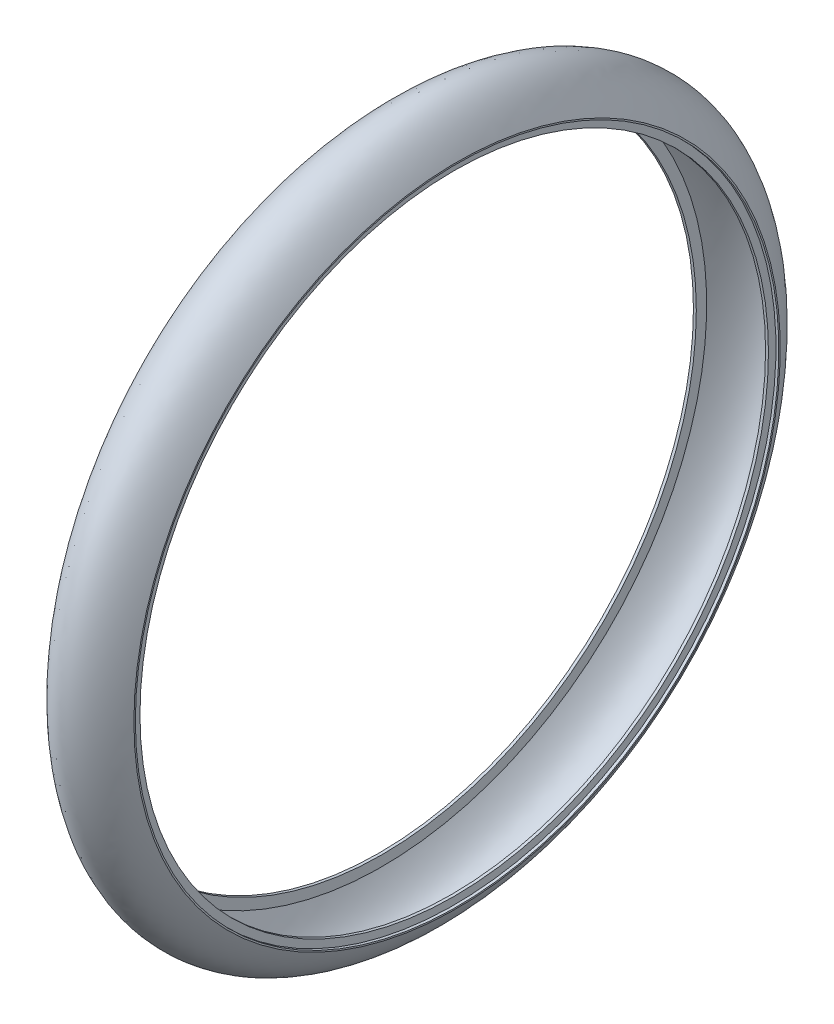
ISO-10303-21;
HEADER;
FILE_DESCRIPTION(('STEP AP214'),'2;1');
FILE_NAME('part.step','',(''),(''),'','','');
FILE_SCHEMA(('AUTOMOTIVE_DESIGN { 1 0 10303 214 1 1 1 1 }'));
ENDSEC;
DATA;
#1=APPLICATION_CONTEXT('core data for automotive mechanical design processes');
#2=APPLICATION_PROTOCOL_DEFINITION('international standard','automotive_design',2000,#1);
#3=PRODUCT_CONTEXT('',#1,'mechanical');
#4=PRODUCT('Part','Part','',(#3));
#5=PRODUCT_RELATED_PRODUCT_CATEGORY('part','',(#4));
#6=PRODUCT_DEFINITION_FORMATION('','',#4);
#7=PRODUCT_DEFINITION_CONTEXT('part definition',#1,'design');
#8=PRODUCT_DEFINITION('design','',#6,#7);
#9=PRODUCT_DEFINITION_SHAPE('','',#8);
#10=(LENGTH_UNIT() NAMED_UNIT(*) SI_UNIT(.MILLI.,.METRE.));
#11=(NAMED_UNIT(*) PLANE_ANGLE_UNIT() SI_UNIT($,.RADIAN.));
#12=(NAMED_UNIT(*) SI_UNIT($,.STERADIAN.) SOLID_ANGLE_UNIT());
#13=UNCERTAINTY_MEASURE_WITH_UNIT(LENGTH_MEASURE(1.E-05),#10,'distance_accuracy_value','');
#14=(GEOMETRIC_REPRESENTATION_CONTEXT(3) GLOBAL_UNCERTAINTY_ASSIGNED_CONTEXT((#13)) GLOBAL_UNIT_ASSIGNED_CONTEXT((#10,
#11,#12)) REPRESENTATION_CONTEXT('',''));
#15=CARTESIAN_POINT('',(0.,0.,0.));
#16=DIRECTION('',(0.,0.,1.));
#17=DIRECTION('',(1.,0.,0.));
#18=AXIS2_PLACEMENT_3D('',#15,#16,#17);
#19=CARTESIAN_POINT('',(-92.7298837551883,0.,0.));
#20=DIRECTION('',(-1.,0.,0.));
#21=DIRECTION('',(0.,0.,1.));
#22=AXIS2_PLACEMENT_3D('',#19,#20,#21);
#23=CYLINDRICAL_SURFACE('',#22,223.);
#24=CARTESIAN_POINT('',(28.,0.,0.));
#25=DIRECTION('',(-1.,0.,0.));
#26=DIRECTION('',(0.,0.,1.));
#27=AXIS2_PLACEMENT_3D('',#24,#25,#26);
#28=CIRCLE('',#27,223.);
#29=CARTESIAN_POINT('',(28.,0.,223.));
#30=VERTEX_POINT('',#29);
#31=EDGE_CURVE('E10',#30,#30,#28,.T.);
#32=ORIENTED_EDGE('',*,*,#31,.F.);
#33=EDGE_LOOP('',(#32));
#34=FACE_BOUND('',#33,.T.);
#35=CARTESIAN_POINT('',(26.,0.,0.));
#36=DIRECTION('',(-1.,0.,0.));
#37=DIRECTION('',(0.,0.,1.));
#38=AXIS2_PLACEMENT_3D('',#35,#36,#37);
#39=CIRCLE('',#38,223.);
#40=CARTESIAN_POINT('',(26.,0.,223.));
#41=VERTEX_POINT('',#40);
#42=EDGE_CURVE('E77',#41,#41,#39,.T.);
#43=ORIENTED_EDGE('',*,*,#42,.T.);
#44=EDGE_LOOP('',(#43));
#45=FACE_BOUND('',#44,.T.);
#46=ADVANCED_FACE('F31',(#34,#45),#23,.F.);
#47=CARTESIAN_POINT('',(28.,223.,0.));
#48=DIRECTION('',(-1.,0.,0.));
#49=DIRECTION('',(0.,0.,1.));
#50=AXIS2_PLACEMENT_3D('',#47,#48,#49);
#51=PLANE('',#50);
#52=CARTESIAN_POINT('',(28.,0.,0.));
#53=DIRECTION('',(-1.,0.,0.));
#54=DIRECTION('',(0.,0.,1.));
#55=AXIS2_PLACEMENT_3D('',#52,#53,#54);
#56=CIRCLE('',#55,224.);
#57=CARTESIAN_POINT('',(28.,0.,224.));
#58=VERTEX_POINT('',#57);
#59=EDGE_CURVE('E37',#58,#58,#56,.T.);
#60=ORIENTED_EDGE('',*,*,#59,.F.);
#61=EDGE_LOOP('',(#60));
#62=FACE_BOUND('',#61,.T.);
#63=ORIENTED_EDGE('',*,*,#31,.T.);
#64=EDGE_LOOP('',(#63));
#65=FACE_BOUND('',#64,.T.);
#66=ADVANCED_FACE('F124',(#62,#65),#51,.F.);
#67=CARTESIAN_POINT('',(28.,224.,0.));
#68=CARTESIAN_POINT('',(0.637105463980107,273.282336613174,0.));
#69=CARTESIAN_POINT('',(-28.,224.,0.));
#70=B_SPLINE_CURVE_WITH_KNOTS('',2,(#67,#68,#69),.UNSPECIFIED.,.F.,.F.,(3,3),(0.,1.),.UNSPECIFIED.);
#71=CARTESIAN_POINT('',(-92.7298837551883,0.,0.));
#72=DIRECTION('',(-1.,0.,0.));
#73=AXIS1_PLACEMENT('',#71,#72);
#74=SURFACE_OF_REVOLUTION('',#70,#73);
#75=CARTESIAN_POINT('',(-28.,0.,0.));
#76=DIRECTION('',(-1.,0.,0.));
#77=DIRECTION('',(0.,0.,1.));
#78=AXIS2_PLACEMENT_3D('',#75,#76,#77);
#79=CIRCLE('',#78,224.);
#80=CARTESIAN_POINT('',(-28.,0.,224.));
#81=VERTEX_POINT('',#80);
#82=EDGE_CURVE('E41',#81,#81,#79,.T.);
#83=ORIENTED_EDGE('',*,*,#82,.F.);
#84=EDGE_LOOP('',(#83));
#85=FACE_BOUND('',#84,.T.);
#86=ORIENTED_EDGE('',*,*,#59,.T.);
#87=EDGE_LOOP('',(#86));
#88=FACE_BOUND('',#87,.T.);
#89=ADVANCED_FACE('F121',(#85,#88),#74,.T.);
#90=CARTESIAN_POINT('',(-28.,223.,0.));
#91=DIRECTION('',(1.,0.,0.));
#92=DIRECTION('',(0.,0.,-1.));
#93=AXIS2_PLACEMENT_3D('',#90,#91,#92);
#94=PLANE('',#93);
#95=CARTESIAN_POINT('',(-28.,0.,0.));
#96=DIRECTION('',(-1.,0.,0.));
#97=DIRECTION('',(0.,0.,1.));
#98=AXIS2_PLACEMENT_3D('',#95,#96,#97);
#99=CIRCLE('',#98,223.);
#100=CARTESIAN_POINT('',(-28.,0.,223.));
#101=VERTEX_POINT('',#100);
#102=EDGE_CURVE('E45',#101,#101,#99,.T.);
#103=ORIENTED_EDGE('',*,*,#102,.F.);
#104=EDGE_LOOP('',(#103));
#105=FACE_BOUND('',#104,.T.);
#106=ORIENTED_EDGE('',*,*,#82,.T.);
#107=EDGE_LOOP('',(#106));
#108=FACE_BOUND('',#107,.T.);
#109=ADVANCED_FACE('F117',(#105,#108),#94,.F.);
#110=CARTESIAN_POINT('',(-92.7298837551883,0.,0.));
#111=DIRECTION('',(-1.,0.,0.));
#112=DIRECTION('',(0.,0.,1.));
#113=AXIS2_PLACEMENT_3D('',#110,#111,#112);
#114=CYLINDRICAL_SURFACE('',#113,223.);
#115=CARTESIAN_POINT('',(-26.,0.,0.));
#116=DIRECTION('',(-1.,0.,0.));
#117=DIRECTION('',(0.,0.,1.));
#118=AXIS2_PLACEMENT_3D('',#115,#116,#117);
#119=CIRCLE('',#118,223.);
#120=CARTESIAN_POINT('',(-26.,0.,223.));
#121=VERTEX_POINT('',#120);
#122=EDGE_CURVE('E50',#121,#121,#119,.T.);
#123=ORIENTED_EDGE('',*,*,#122,.F.);
#124=EDGE_LOOP('',(#123));
#125=FACE_BOUND('',#124,.T.);
#126=ORIENTED_EDGE('',*,*,#102,.T.);
#127=EDGE_LOOP('',(#126));
#128=FACE_BOUND('',#127,.T.);
#129=ADVANCED_FACE('F113',(#125,#128),#114,.F.);
#130=CARTESIAN_POINT('',(-26.,217.8,0.));
#131=DIRECTION('',(1.,0.,0.));
#132=DIRECTION('',(0.,0.,-1.));
#133=AXIS2_PLACEMENT_3D('',#130,#131,#132);
#134=PLANE('',#133);
#135=CARTESIAN_POINT('',(-26.,0.,0.));
#136=DIRECTION('',(-1.,0.,0.));
#137=DIRECTION('',(0.,0.,1.));
#138=AXIS2_PLACEMENT_3D('',#135,#136,#137);
#139=CIRCLE('',#138,217.8);
#140=CARTESIAN_POINT('',(-26.,0.,217.8));
#141=VERTEX_POINT('',#140);
#142=EDGE_CURVE('E53',#141,#141,#139,.T.);
#143=ORIENTED_EDGE('',*,*,#142,.F.);
#144=EDGE_LOOP('',(#143));
#145=FACE_BOUND('',#144,.T.);
#146=ORIENTED_EDGE('',*,*,#122,.T.);
#147=EDGE_LOOP('',(#146));
#148=FACE_BOUND('',#147,.T.);
#149=ADVANCED_FACE('F109',(#145,#148),#134,.F.);
#150=CARTESIAN_POINT('',(-92.7298837551883,0.,0.));
#151=DIRECTION('',(-1.,0.,0.));
#152=DIRECTION('',(0.,0.,1.));
#153=AXIS2_PLACEMENT_3D('',#150,#151,#152);
#154=CYLINDRICAL_SURFACE('',#153,217.8);
#155=CARTESIAN_POINT('',(-24.,0.,0.));
#156=DIRECTION('',(-1.,0.,0.));
#157=DIRECTION('',(0.,0.,1.));
#158=AXIS2_PLACEMENT_3D('',#155,#156,#157);
#159=CIRCLE('',#158,217.8);
#160=CARTESIAN_POINT('',(-24.,0.,217.8));
#161=VERTEX_POINT('',#160);
#162=EDGE_CURVE('E56',#161,#161,#159,.T.);
#163=ORIENTED_EDGE('',*,*,#162,.F.);
#164=EDGE_LOOP('',(#163));
#165=FACE_BOUND('',#164,.T.);
#166=ORIENTED_EDGE('',*,*,#142,.T.);
#167=EDGE_LOOP('',(#166));
#168=FACE_BOUND('',#167,.T.);
#169=ADVANCED_FACE('F105',(#165,#168),#154,.F.);
#170=CARTESIAN_POINT('',(-24.,217.8,0.));
#171=DIRECTION('',(-1.,0.,0.));
#172=DIRECTION('',(0.,0.,1.));
#173=AXIS2_PLACEMENT_3D('',#170,#171,#172);
#174=PLANE('',#173);
#175=CARTESIAN_POINT('',(-24.,0.,0.));
#176=DIRECTION('',(-1.,0.,0.));
#177=DIRECTION('',(0.,0.,1.));
#178=AXIS2_PLACEMENT_3D('',#175,#176,#177);
#179=CIRCLE('',#178,225.);
#180=CARTESIAN_POINT('',(-24.,0.,225.));
#181=VERTEX_POINT('',#180);
#182=EDGE_CURVE('E59',#181,#181,#179,.T.);
#183=ORIENTED_EDGE('',*,*,#182,.F.);
#184=EDGE_LOOP('',(#183));
#185=FACE_BOUND('',#184,.T.);
#186=ORIENTED_EDGE('',*,*,#162,.T.);
#187=EDGE_LOOP('',(#186));
#188=FACE_BOUND('',#187,.T.);
#189=ADVANCED_FACE('F101',(#185,#188),#174,.F.);
#190=CARTESIAN_POINT('',(-92.7298837551883,0.,0.));
#191=DIRECTION('',(-1.,0.,0.));
#192=DIRECTION('',(0.,0.,1.));
#193=AXIS2_PLACEMENT_3D('',#190,#191,#192);
#194=CYLINDRICAL_SURFACE('',#193,225.);
#195=CARTESIAN_POINT('',(-25.0812185745327,0.,0.));
#196=DIRECTION('',(-1.,0.,0.));
#197=DIRECTION('',(0.,0.,1.));
#198=AXIS2_PLACEMENT_3D('',#195,#196,#197);
#199=CIRCLE('',#198,225.);
#200=CARTESIAN_POINT('',(-25.0812185745327,0.,225.));
#201=VERTEX_POINT('',#200);
#202=EDGE_CURVE('E62',#201,#201,#199,.T.);
#203=ORIENTED_EDGE('',*,*,#202,.F.);
#204=EDGE_LOOP('',(#203));
#205=FACE_BOUND('',#204,.T.);
#206=ORIENTED_EDGE('',*,*,#182,.T.);
#207=EDGE_LOOP('',(#206));
#208=FACE_BOUND('',#207,.T.);
#209=ADVANCED_FACE('F96',(#205,#208),#194,.T.);
#210=CARTESIAN_POINT('',(-25.0812185745328,224.999999999998,0.));
#211=CARTESIAN_POINT('',(-24.8037516076725,225.457770919652,0.));
#212=CARTESIAN_POINT('',(-24.2376144357679,226.377618942942,0.));
#213=CARTESIAN_POINT('',(-23.1197728060431,228.136935628071,0.));
#214=CARTESIAN_POINT('',(-21.7225300498716,230.230207132706,0.));
#215=CARTESIAN_POINT('',(-20.0553180107851,232.558380785043,0.));
#216=CARTESIAN_POINT('',(-17.8433424222974,235.422340199443,0.));
#217=CARTESIAN_POINT('',(-15.1032912847148,238.549071727946,0.));
#218=CARTESIAN_POINT('',(-11.8666412019054,241.577463878961,0.));
#219=CARTESIAN_POINT('',(-8.69764798479491,243.888532380022,0.));
#220=CARTESIAN_POINT('',(-4.57899131297883,246.034494913131,0.));
#221=CARTESIAN_POINT('',(0.334957233055467,247.047411066924,0.));
#222=CARTESIAN_POINT('',(5.21025809817519,246.029099891945,0.));
#223=CARTESIAN_POINT('',(9.26114078143556,243.884708592758,0.));
#224=CARTESIAN_POINT('',(12.3626055868098,241.575555693327,0.));
#225=CARTESIAN_POINT('',(15.5150713633354,238.548885252921,0.));
#226=CARTESIAN_POINT('',(18.1707605001652,235.422942751137,0.));
#227=CARTESIAN_POINT('',(20.3064907417711,232.559178115047,0.));
#228=CARTESIAN_POINT('',(21.9121171947566,230.230947024052,0.));
#229=CARTESIAN_POINT('',(23.2542726672743,228.137440007697,0.));
#230=CARTESIAN_POINT('',(24.3259193698897,226.37789185953,0.));
#231=CARTESIAN_POINT('',(24.8679946210701,225.457809999204,0.));
#232=CARTESIAN_POINT('',(25.1334476360352,225.,0.));
#233=B_SPLINE_CURVE_WITH_KNOTS('',3,(#210,#211,#212,#213,#214,#215,#216,#217,#218,#219,#220,
#221,#222,#223,#224,#225,#226,#227,#228,#229,#230,#231,#232),.UNSPECIFIED.,.F.,.F.,(4,1,1,1,1,1,
1,1,1,1,1,1,1,1,1,1,1,1,1,1,4),(0.0211090346050007,0.0360799143662773,0.0510507941275538,
0.080992553650107,0.11093431317266,0.140876072695213,0.200759591740319,0.260643110785426,
0.320526629830532,0.380410148875638,0.500177186965851,0.619944225056063,0.67982774410117,
0.739711263146276,0.799594782191382,0.859478301236488,0.889420060759041,0.919361820281595,
0.949303579804148,0.964274459565424,0.979245339326701),.UNSPECIFIED.);
#234=CARTESIAN_POINT('',(-92.7298837551883,0.,0.));
#235=DIRECTION('',(-1.,0.,0.));
#236=AXIS1_PLACEMENT('',#234,#235);
#237=SURFACE_OF_REVOLUTION('',#233,#236);
#238=CARTESIAN_POINT('',(25.1334476360352,0.,0.));
#239=DIRECTION('',(-1.,0.,0.));
#240=DIRECTION('',(0.,0.,1.));
#241=AXIS2_PLACEMENT_3D('',#238,#239,#240);
#242=CIRCLE('',#241,225.);
#243=CARTESIAN_POINT('',(25.1334476360352,0.,225.));
#244=VERTEX_POINT('',#243);
#245=EDGE_CURVE('E65',#244,#244,#242,.T.);
#246=ORIENTED_EDGE('',*,*,#245,.F.);
#247=EDGE_LOOP('',(#246));
#248=FACE_BOUND('',#247,.T.);
#249=ORIENTED_EDGE('',*,*,#202,.T.);
#250=EDGE_LOOP('',(#249));
#251=FACE_BOUND('',#250,.T.);
#252=ADVANCED_FACE('F91',(#248,#251),#237,.T.);
#253=CARTESIAN_POINT('',(-92.7298837551883,0.,0.));
#254=DIRECTION('',(-1.,0.,0.));
#255=DIRECTION('',(0.,0.,1.));
#256=AXIS2_PLACEMENT_3D('',#253,#254,#255);
#257=CYLINDRICAL_SURFACE('',#256,225.);
#258=CARTESIAN_POINT('',(24.,0.,0.));
#259=DIRECTION('',(-1.,0.,0.));
#260=DIRECTION('',(0.,0.,1.));
#261=AXIS2_PLACEMENT_3D('',#258,#259,#260);
#262=CIRCLE('',#261,225.);
#263=CARTESIAN_POINT('',(24.,0.,225.));
#264=VERTEX_POINT('',#263);
#265=EDGE_CURVE('E68',#264,#264,#262,.T.);
#266=ORIENTED_EDGE('',*,*,#265,.F.);
#267=EDGE_LOOP('',(#266));
#268=FACE_BOUND('',#267,.T.);
#269=ORIENTED_EDGE('',*,*,#245,.T.);
#270=EDGE_LOOP('',(#269));
#271=FACE_BOUND('',#270,.T.);
#272=ADVANCED_FACE('F95',(#268,#271),#257,.T.);
#273=CARTESIAN_POINT('',(24.,217.8,0.));
#274=DIRECTION('',(1.,0.,0.));
#275=DIRECTION('',(0.,0.,-1.));
#276=AXIS2_PLACEMENT_3D('',#273,#274,#275);
#277=PLANE('',#276);
#278=CARTESIAN_POINT('',(24.,0.,0.));
#279=DIRECTION('',(-1.,0.,0.));
#280=DIRECTION('',(0.,0.,1.));
#281=AXIS2_PLACEMENT_3D('',#278,#279,#280);
#282=CIRCLE('',#281,217.8);
#283=CARTESIAN_POINT('',(24.,0.,217.8));
#284=VERTEX_POINT('',#283);
#285=EDGE_CURVE('E71',#284,#284,#282,.T.);
#286=ORIENTED_EDGE('',*,*,#285,.F.);
#287=EDGE_LOOP('',(#286));
#288=FACE_BOUND('',#287,.T.);
#289=ORIENTED_EDGE('',*,*,#265,.T.);
#290=EDGE_LOOP('',(#289));
#291=FACE_BOUND('',#290,.T.);
#292=ADVANCED_FACE('F146',(#288,#291),#277,.F.);
#293=CARTESIAN_POINT('',(-92.7298837551883,0.,0.));
#294=DIRECTION('',(-1.,0.,0.));
#295=DIRECTION('',(0.,0.,1.));
#296=AXIS2_PLACEMENT_3D('',#293,#294,#295);
#297=CYLINDRICAL_SURFACE('',#296,217.8);
#298=CARTESIAN_POINT('',(26.,0.,0.));
#299=DIRECTION('',(-1.,0.,0.));
#300=DIRECTION('',(0.,0.,1.));
#301=AXIS2_PLACEMENT_3D('',#298,#299,#300);
#302=CIRCLE('',#301,217.8);
#303=CARTESIAN_POINT('',(26.,0.,217.8));
#304=VERTEX_POINT('',#303);
#305=EDGE_CURVE('E74',#304,#304,#302,.T.);
#306=ORIENTED_EDGE('',*,*,#305,.F.);
#307=EDGE_LOOP('',(#306));
#308=FACE_BOUND('',#307,.T.);
#309=ORIENTED_EDGE('',*,*,#285,.T.);
#310=EDGE_LOOP('',(#309));
#311=FACE_BOUND('',#310,.T.);
#312=ADVANCED_FACE('F140',(#308,#311),#297,.F.);
#313=CARTESIAN_POINT('',(26.,217.8,0.));
#314=DIRECTION('',(-1.,0.,0.));
#315=DIRECTION('',(0.,0.,1.));
#316=AXIS2_PLACEMENT_3D('',#313,#314,#315);
#317=PLANE('',#316);
#318=ORIENTED_EDGE('',*,*,#42,.F.);
#319=EDGE_LOOP('',(#318));
#320=FACE_BOUND('',#319,.T.);
#321=ORIENTED_EDGE('',*,*,#305,.T.);
#322=EDGE_LOOP('',(#321));
#323=FACE_BOUND('',#322,.T.);
#324=ADVANCED_FACE('F137',(#320,#323),#317,.F.);
#325=CLOSED_SHELL('',(#46,#66,#89,#109,#129,#149,#169,#189,#209,#252,#272,#292,#312,#324));
#326=MANIFOLD_SOLID_BREP('B2',#325);
#327=ADVANCED_BREP_SHAPE_REPRESENTATION('',(#18,#326),#14);
#328=SHAPE_DEFINITION_REPRESENTATION(#9,#327);
ENDSEC;
END-ISO-10303-21;
